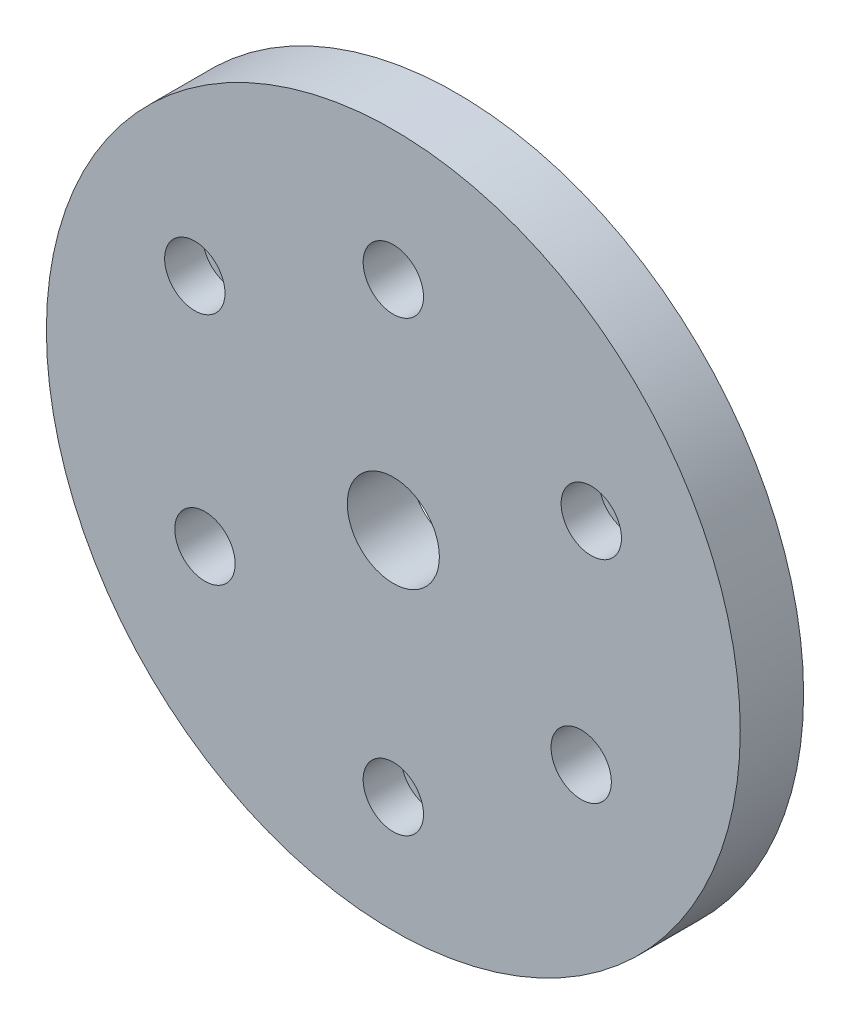
ISO-10303-21;
HEADER;
FILE_DESCRIPTION(('STEP AP214'),'2;1');
FILE_NAME('part.step','',(''),(''),'','','');
FILE_SCHEMA(('AUTOMOTIVE_DESIGN { 1 0 10303 214 1 1 1 1 }'));
ENDSEC;
DATA;
#1=APPLICATION_CONTEXT('core data for automotive mechanical design processes');
#2=APPLICATION_PROTOCOL_DEFINITION('international standard','automotive_design',2000,#1);
#3=PRODUCT_CONTEXT('',#1,'mechanical');
#4=PRODUCT('Part','Part','',(#3));
#5=PRODUCT_RELATED_PRODUCT_CATEGORY('part','',(#4));
#6=PRODUCT_DEFINITION_FORMATION('','',#4);
#7=PRODUCT_DEFINITION_CONTEXT('part definition',#1,'design');
#8=PRODUCT_DEFINITION('design','',#6,#7);
#9=PRODUCT_DEFINITION_SHAPE('','',#8);
#10=(LENGTH_UNIT() NAMED_UNIT(*) SI_UNIT(.MILLI.,.METRE.));
#11=(NAMED_UNIT(*) PLANE_ANGLE_UNIT() SI_UNIT($,.RADIAN.));
#12=(NAMED_UNIT(*) SI_UNIT($,.STERADIAN.) SOLID_ANGLE_UNIT());
#13=UNCERTAINTY_MEASURE_WITH_UNIT(LENGTH_MEASURE(1.E-05),#10,'distance_accuracy_value','');
#14=(GEOMETRIC_REPRESENTATION_CONTEXT(3) GLOBAL_UNCERTAINTY_ASSIGNED_CONTEXT((#13)) GLOBAL_UNIT_ASSIGNED_CONTEXT((#10,
#11,#12)) REPRESENTATION_CONTEXT('',''));
#15=CARTESIAN_POINT('',(0.,0.,0.));
#16=DIRECTION('',(0.,0.,1.));
#17=DIRECTION('',(1.,0.,0.));
#18=AXIS2_PLACEMENT_3D('',#15,#16,#17);
#19=CARTESIAN_POINT('',(0.00189853889458936,0.00435108764818228,0.84932468330565));
#20=DIRECTION('',(0.,0.,1.));
#21=DIRECTION('',(1.,0.,0.));
#22=AXIS2_PLACEMENT_3D('',#19,#20,#21);
#23=CYLINDRICAL_SURFACE('',#22,28.75);
#24=CARTESIAN_POINT('',(0.00189853889458936,0.00435108764818228,0.84932468330565));
#25=DIRECTION('',(0.,0.,1.));
#26=DIRECTION('',(1.,0.,0.));
#27=AXIS2_PLACEMENT_3D('',#24,#25,#26);
#28=CIRCLE('',#27,28.75);
#29=CARTESIAN_POINT('',(28.7518985388946,0.00435108764818228,0.84932468330565));
#30=VERTEX_POINT('',#29);
#31=EDGE_CURVE('E10',#30,#30,#28,.T.);
#32=ORIENTED_EDGE('',*,*,#31,.T.);
#33=EDGE_LOOP('',(#32));
#34=FACE_BOUND('',#33,.T.);
#35=CARTESIAN_POINT('',(0.00189853889458936,0.00435108764818228,6.09932468330565));
#36=DIRECTION('',(0.,0.,1.));
#37=DIRECTION('',(1.,0.,0.));
#38=AXIS2_PLACEMENT_3D('',#35,#36,#37);
#39=CIRCLE('',#38,28.75);
#40=CARTESIAN_POINT('',(28.7518985388946,0.00435108764818228,6.09932468330565));
#41=VERTEX_POINT('',#40);
#42=EDGE_CURVE('E92',#41,#41,#39,.T.);
#43=ORIENTED_EDGE('',*,*,#42,.F.);
#44=EDGE_LOOP('',(#43));
#45=FACE_BOUND('',#44,.T.);
#46=ADVANCED_FACE('F35',(#34,#45),#23,.T.);
#47=CARTESIAN_POINT('',(0.00189853889458936,0.00435108764818228,0.84932468330565));
#48=DIRECTION('',(0.,0.,1.));
#49=DIRECTION('',(1.,0.,0.));
#50=AXIS2_PLACEMENT_3D('',#47,#48,#49);
#51=PLANE('',#50);
#52=CARTESIAN_POINT('',(0.00189853889458936,-19.13581368349,0.84932468330565));
#53=DIRECTION('',(0.,0.,1.));
#54=DIRECTION('',(1.,0.,0.));
#55=AXIS2_PLACEMENT_3D('',#52,#53,#54);
#56=CIRCLE('',#55,1.27143012941237);
#57=CARTESIAN_POINT('',(1.27332866830696,-19.13581368349,0.84932468330565));
#58=VERTEX_POINT('',#57);
#59=EDGE_CURVE('E38',#58,#58,#56,.T.);
#60=ORIENTED_EDGE('',*,*,#59,.T.);
#61=EDGE_LOOP('',(#60));
#62=FACE_BOUND('',#61,.T.);
#63=CARTESIAN_POINT('',(16.4056018001428,8.88352728240437,0.84932468330565));
#64=DIRECTION('',(0.,0.,1.));
#65=DIRECTION('',(1.,0.,0.));
#66=AXIS2_PLACEMENT_3D('',#63,#64,#65);
#67=CIRCLE('',#66,1.27143012941237);
#68=CARTESIAN_POINT('',(17.6770319295552,8.88352728240437,0.84932468330565));
#69=VERTEX_POINT('',#68);
#70=EDGE_CURVE('E55',#69,#69,#67,.T.);
#71=ORIENTED_EDGE('',*,*,#70,.T.);
#72=EDGE_LOOP('',(#71));
#73=FACE_BOUND('',#72,.T.);
#74=CARTESIAN_POINT('',(-16.4490664062779,10.0328198584992,0.84932468330565));
#75=DIRECTION('',(0.,0.,1.));
#76=DIRECTION('',(1.,0.,0.));
#77=AXIS2_PLACEMENT_3D('',#74,#75,#76);
#78=CIRCLE('',#77,1.27143012941237);
#79=CARTESIAN_POINT('',(-15.1776362768655,10.0328198584992,0.84932468330565));
#80=VERTEX_POINT('',#79);
#81=EDGE_CURVE('E51',#80,#80,#78,.T.);
#82=ORIENTED_EDGE('',*,*,#81,.T.);
#83=EDGE_LOOP('',(#82));
#84=FACE_BOUND('',#83,.T.);
#85=CARTESIAN_POINT('',(0.00189853889458936,0.00435108764818228,0.84932468330565));
#86=DIRECTION('',(0.,0.,1.));
#87=DIRECTION('',(1.,0.,0.));
#88=AXIS2_PLACEMENT_3D('',#85,#86,#87);
#89=CIRCLE('',#88,3.81608438061848);
#90=CARTESIAN_POINT('',(3.81798291951307,0.00435108764818228,0.84932468330565));
#91=VERTEX_POINT('',#90);
#92=EDGE_CURVE('E95',#91,#91,#89,.T.);
#93=ORIENTED_EDGE('',*,*,#92,.T.);
#94=EDGE_LOOP('',(#93));
#95=FACE_BOUND('',#94,.T.);
#96=CARTESIAN_POINT('',(-15.607569395895,-8.95915887178049,0.84932468330565));
#97=DIRECTION('',(0.,0.,1.));
#98=DIRECTION('',(1.,0.,0.));
#99=AXIS2_PLACEMENT_3D('',#96,#97,#98);
#100=CIRCLE('',#99,2.50000000000007);
#101=CARTESIAN_POINT('',(-13.1075693958949,-8.95915887178049,0.84932468330565));
#102=VERTEX_POINT('',#101);
#103=EDGE_CURVE('E98',#102,#102,#100,.T.);
#104=ORIENTED_EDGE('',*,*,#103,.T.);
#105=EDGE_LOOP('',(#104));
#106=FACE_BOUND('',#105,.T.);
#107=CARTESIAN_POINT('',(0.00189853889459128,18.0043510876482,0.84932468330565));
#108=DIRECTION('',(0.,0.,1.));
#109=DIRECTION('',(1.,0.,0.));
#110=AXIS2_PLACEMENT_3D('',#107,#108,#109);
#111=CIRCLE('',#110,2.5);
#112=CARTESIAN_POINT('',(2.50189853889459,18.0043510876482,0.84932468330565));
#113=VERTEX_POINT('',#112);
#114=EDGE_CURVE('E47',#113,#113,#111,.T.);
#115=ORIENTED_EDGE('',*,*,#114,.T.);
#116=EDGE_LOOP('',(#115));
#117=FACE_BOUND('',#116,.T.);
#118=CARTESIAN_POINT('',(15.5692598382296,-9.03208970372346,0.84932468330565));
#119=DIRECTION('',(0.,0.,1.));
#120=DIRECTION('',(1.,0.,0.));
#121=AXIS2_PLACEMENT_3D('',#118,#119,#120);
#122=CIRCLE('',#121,2.49999999999985);
#123=CARTESIAN_POINT('',(18.0692598382295,-9.03208970372346,0.84932468330565));
#124=VERTEX_POINT('',#123);
#125=EDGE_CURVE('E42',#124,#124,#122,.T.);
#126=ORIENTED_EDGE('',*,*,#125,.T.);
#127=EDGE_LOOP('',(#126));
#128=FACE_BOUND('',#127,.T.);
#129=ORIENTED_EDGE('',*,*,#31,.F.);
#130=EDGE_LOOP('',(#129));
#131=FACE_BOUND('',#130,.T.);
#132=ADVANCED_FACE('F103',(#62,#73,#84,#95,#106,#117,#128,#131),#51,.F.);
#133=CARTESIAN_POINT('',(15.5692598382296,-9.03208970372346,0.84932468330565));
#134=DIRECTION('',(0.,0.,1.));
#135=DIRECTION('',(1.,0.,0.));
#136=AXIS2_PLACEMENT_3D('',#133,#134,#135);
#137=CYLINDRICAL_SURFACE('',#136,2.49999999999985);
#138=ORIENTED_EDGE('',*,*,#125,.F.);
#139=EDGE_LOOP('',(#138));
#140=FACE_BOUND('',#139,.T.);
#141=CARTESIAN_POINT('',(15.5692598382296,-9.03208970372346,6.09932468330565));
#142=DIRECTION('',(0.,0.,1.));
#143=DIRECTION('',(1.,0.,0.));
#144=AXIS2_PLACEMENT_3D('',#141,#142,#143);
#145=CIRCLE('',#144,2.49999999999985);
#146=CARTESIAN_POINT('',(18.0692598382295,-9.03208970372346,6.09932468330565));
#147=VERTEX_POINT('',#146);
#148=EDGE_CURVE('E89',#147,#147,#145,.T.);
#149=ORIENTED_EDGE('',*,*,#148,.T.);
#150=EDGE_LOOP('',(#149));
#151=FACE_BOUND('',#150,.T.);
#152=ADVANCED_FACE('F110',(#140,#151),#137,.F.);
#153=CARTESIAN_POINT('',(0.00189853889459128,18.0043510876482,0.84932468330565));
#154=DIRECTION('',(0.,0.,1.));
#155=DIRECTION('',(1.,0.,0.));
#156=AXIS2_PLACEMENT_3D('',#153,#154,#155);
#157=CYLINDRICAL_SURFACE('',#156,2.5);
#158=ORIENTED_EDGE('',*,*,#114,.F.);
#159=EDGE_LOOP('',(#158));
#160=FACE_BOUND('',#159,.T.);
#161=CARTESIAN_POINT('',(0.00189853889459128,18.0043510876482,6.09932468330565));
#162=DIRECTION('',(0.,0.,1.));
#163=DIRECTION('',(1.,0.,0.));
#164=AXIS2_PLACEMENT_3D('',#161,#162,#163);
#165=CIRCLE('',#164,2.5);
#166=CARTESIAN_POINT('',(2.50189853889459,18.0043510876482,6.09932468330565));
#167=VERTEX_POINT('',#166);
#168=EDGE_CURVE('E86',#167,#167,#165,.T.);
#169=ORIENTED_EDGE('',*,*,#168,.T.);
#170=EDGE_LOOP('',(#169));
#171=FACE_BOUND('',#170,.T.);
#172=ADVANCED_FACE('F106',(#160,#171),#157,.F.);
#173=CARTESIAN_POINT('',(-15.607569395895,-8.95915887178049,0.84932468330565));
#174=DIRECTION('',(0.,0.,1.));
#175=DIRECTION('',(1.,0.,0.));
#176=AXIS2_PLACEMENT_3D('',#173,#174,#175);
#177=CYLINDRICAL_SURFACE('',#176,2.50000000000007);
#178=ORIENTED_EDGE('',*,*,#103,.F.);
#179=EDGE_LOOP('',(#178));
#180=FACE_BOUND('',#179,.T.);
#181=CARTESIAN_POINT('',(-15.607569395895,-8.95915887178049,6.09932468330565));
#182=DIRECTION('',(0.,0.,1.));
#183=DIRECTION('',(1.,0.,0.));
#184=AXIS2_PLACEMENT_3D('',#181,#182,#183);
#185=CIRCLE('',#184,2.50000000000007);
#186=CARTESIAN_POINT('',(-13.1075693958949,-8.95915887178049,6.09932468330565));
#187=VERTEX_POINT('',#186);
#188=EDGE_CURVE('E83',#187,#187,#185,.T.);
#189=ORIENTED_EDGE('',*,*,#188,.T.);
#190=EDGE_LOOP('',(#189));
#191=FACE_BOUND('',#190,.T.);
#192=ADVANCED_FACE('F109',(#180,#191),#177,.F.);
#193=CARTESIAN_POINT('',(0.00189853889458936,0.00435108764818228,0.84932468330565));
#194=DIRECTION('',(0.,0.,1.));
#195=DIRECTION('',(1.,0.,0.));
#196=AXIS2_PLACEMENT_3D('',#193,#194,#195);
#197=CYLINDRICAL_SURFACE('',#196,3.81608438061848);
#198=ORIENTED_EDGE('',*,*,#92,.F.);
#199=EDGE_LOOP('',(#198));
#200=FACE_BOUND('',#199,.T.);
#201=CARTESIAN_POINT('',(0.00189853889458936,0.00435108764818228,6.09932468330565));
#202=DIRECTION('',(0.,0.,1.));
#203=DIRECTION('',(1.,0.,0.));
#204=AXIS2_PLACEMENT_3D('',#201,#202,#203);
#205=CIRCLE('',#204,3.81608438061848);
#206=CARTESIAN_POINT('',(3.81798291951307,0.00435108764818228,6.09932468330565));
#207=VERTEX_POINT('',#206);
#208=EDGE_CURVE('E53',#207,#207,#205,.T.);
#209=ORIENTED_EDGE('',*,*,#208,.T.);
#210=EDGE_LOOP('',(#209));
#211=FACE_BOUND('',#210,.T.);
#212=ADVANCED_FACE('F118',(#200,#211),#197,.F.);
#213=CARTESIAN_POINT('',(0.00189853889458936,0.00435108764818228,6.09932468330565));
#214=DIRECTION('',(0.,0.,1.));
#215=DIRECTION('',(1.,0.,0.));
#216=AXIS2_PLACEMENT_3D('',#213,#214,#215);
#217=PLANE('',#216);
#218=CARTESIAN_POINT('',(0.00189853889458936,-19.13581368349,6.09932468330565));
#219=DIRECTION('',(0.,0.,1.));
#220=DIRECTION('',(1.,0.,0.));
#221=AXIS2_PLACEMENT_3D('',#218,#219,#220);
#222=CIRCLE('',#221,2.5);
#223=CARTESIAN_POINT('',(2.50189853889459,-19.13581368349,6.09932468330565));
#224=VERTEX_POINT('',#223);
#225=EDGE_CURVE('E215',#224,#224,#222,.T.);
#226=ORIENTED_EDGE('',*,*,#225,.F.);
#227=EDGE_LOOP('',(#226));
#228=FACE_BOUND('',#227,.T.);
#229=CARTESIAN_POINT('',(16.4056018001428,8.88352728240437,6.09932468330565));
#230=DIRECTION('',(0.,0.,1.));
#231=DIRECTION('',(1.,0.,0.));
#232=AXIS2_PLACEMENT_3D('',#229,#230,#231);
#233=CIRCLE('',#232,2.5);
#234=CARTESIAN_POINT('',(18.9056018001428,8.88352728240437,6.09932468330565));
#235=VERTEX_POINT('',#234);
#236=EDGE_CURVE('E225',#235,#235,#233,.T.);
#237=ORIENTED_EDGE('',*,*,#236,.F.);
#238=EDGE_LOOP('',(#237));
#239=FACE_BOUND('',#238,.T.);
#240=CARTESIAN_POINT('',(-16.4490664062779,10.0328198584992,6.09932468330565));
#241=DIRECTION('',(0.,0.,1.));
#242=DIRECTION('',(1.,0.,0.));
#243=AXIS2_PLACEMENT_3D('',#240,#241,#242);
#244=CIRCLE('',#243,2.5);
#245=CARTESIAN_POINT('',(-13.9490664062779,10.0328198584992,6.09932468330565));
#246=VERTEX_POINT('',#245);
#247=EDGE_CURVE('E57',#246,#246,#244,.T.);
#248=ORIENTED_EDGE('',*,*,#247,.F.);
#249=EDGE_LOOP('',(#248));
#250=FACE_BOUND('',#249,.T.);
#251=ORIENTED_EDGE('',*,*,#188,.F.);
#252=EDGE_LOOP('',(#251));
#253=FACE_BOUND('',#252,.T.);
#254=ORIENTED_EDGE('',*,*,#148,.F.);
#255=EDGE_LOOP('',(#254));
#256=FACE_BOUND('',#255,.T.);
#257=ORIENTED_EDGE('',*,*,#42,.T.);
#258=EDGE_LOOP('',(#257));
#259=FACE_BOUND('',#258,.T.);
#260=ORIENTED_EDGE('',*,*,#168,.F.);
#261=EDGE_LOOP('',(#260));
#262=FACE_BOUND('',#261,.T.);
#263=ORIENTED_EDGE('',*,*,#208,.F.);
#264=EDGE_LOOP('',(#263));
#265=FACE_BOUND('',#264,.T.);
#266=ADVANCED_FACE('F114',(#228,#239,#250,#253,#256,#259,#262,#265),#217,.T.);
#267=CARTESIAN_POINT('',(-16.4490664062779,10.0328198584992,1.09932468330565));
#268=DIRECTION('',(0.,0.,1.));
#269=DIRECTION('',(1.,0.,0.));
#270=AXIS2_PLACEMENT_3D('',#267,#268,#269);
#271=CONICAL_SURFACE('',#270,1.6875,1.02974425867665);
#272=CARTESIAN_POINT('',(-16.4490664062779,10.0328198584992,1.09932468330565));
#273=DIRECTION('',(0.,0.,1.));
#274=DIRECTION('',(1.,0.,0.));
#275=AXIS2_PLACEMENT_3D('',#272,#273,#274);
#276=CIRCLE('',#275,1.6875);
#277=CARTESIAN_POINT('',(-14.7615664062779,10.0328198584992,1.09932468330565));
#278=VERTEX_POINT('',#277);
#279=EDGE_CURVE('E54',#278,#278,#276,.T.);
#280=ORIENTED_EDGE('',*,*,#279,.T.);
#281=EDGE_LOOP('',(#280));
#282=FACE_BOUND('',#281,.T.);
#283=ORIENTED_EDGE('',*,*,#81,.F.);
#284=EDGE_LOOP('',(#283));
#285=FACE_BOUND('',#284,.T.);
#286=ADVANCED_FACE('F117',(#282,#285),#271,.F.);
#287=CARTESIAN_POINT('',(-16.4490664062779,10.0328198584992,6.09932468330565));
#288=DIRECTION('',(0.,0.,1.));
#289=DIRECTION('',(1.,0.,0.));
#290=AXIS2_PLACEMENT_3D('',#287,#288,#289);
#291=CYLINDRICAL_SURFACE('',#290,1.6875);
#292=ORIENTED_EDGE('',*,*,#279,.F.);
#293=EDGE_LOOP('',(#292));
#294=FACE_BOUND('',#293,.T.);
#295=CARTESIAN_POINT('',(-16.4490664062779,10.0328198584992,2.94932468330565));
#296=DIRECTION('',(0.,0.,1.));
#297=DIRECTION('',(1.,0.,0.));
#298=AXIS2_PLACEMENT_3D('',#295,#296,#297);
#299=CIRCLE('',#298,1.6875);
#300=CARTESIAN_POINT('',(-14.7615664062779,10.0328198584992,2.94932468330565));
#301=VERTEX_POINT('',#300);
#302=EDGE_CURVE('E76',#301,#301,#299,.T.);
#303=ORIENTED_EDGE('',*,*,#302,.T.);
#304=EDGE_LOOP('',(#303));
#305=FACE_BOUND('',#304,.T.);
#306=ADVANCED_FACE('F160',(#294,#305),#291,.F.);
#307=CARTESIAN_POINT('',(-14.7615664062779,10.0328198584992,2.94932468330565));
#308=DIRECTION('',(0.,0.,-1.));
#309=DIRECTION('',(-1.,0.,0.));
#310=AXIS2_PLACEMENT_3D('',#307,#308,#309);
#311=PLANE('',#310);
#312=ORIENTED_EDGE('',*,*,#302,.F.);
#313=EDGE_LOOP('',(#312));
#314=FACE_BOUND('',#313,.T.);
#315=CARTESIAN_POINT('',(-16.4490664062779,10.0328198584992,2.94932468330565));
#316=DIRECTION('',(0.,0.,1.));
#317=DIRECTION('',(1.,0.,0.));
#318=AXIS2_PLACEMENT_3D('',#315,#316,#317);
#319=CIRCLE('',#318,2.5);
#320=CARTESIAN_POINT('',(-13.9490664062779,10.0328198584992,2.94932468330565));
#321=VERTEX_POINT('',#320);
#322=EDGE_CURVE('E62',#321,#321,#319,.T.);
#323=ORIENTED_EDGE('',*,*,#322,.T.);
#324=EDGE_LOOP('',(#323));
#325=FACE_BOUND('',#324,.T.);
#326=ADVANCED_FACE('F166',(#314,#325),#311,.F.);
#327=CARTESIAN_POINT('',(-16.4490664062779,10.0328198584992,6.09932468330565));
#328=DIRECTION('',(0.,0.,1.));
#329=DIRECTION('',(1.,0.,0.));
#330=AXIS2_PLACEMENT_3D('',#327,#328,#329);
#331=CYLINDRICAL_SURFACE('',#330,2.5);
#332=ORIENTED_EDGE('',*,*,#322,.F.);
#333=EDGE_LOOP('',(#332));
#334=FACE_BOUND('',#333,.T.);
#335=ORIENTED_EDGE('',*,*,#247,.T.);
#336=EDGE_LOOP('',(#335));
#337=FACE_BOUND('',#336,.T.);
#338=ADVANCED_FACE('F172',(#334,#337),#331,.F.);
#339=CARTESIAN_POINT('',(16.4056018001428,8.88352728240437,1.09932468330565));
#340=DIRECTION('',(0.,0.,1.));
#341=DIRECTION('',(1.,0.,0.));
#342=AXIS2_PLACEMENT_3D('',#339,#340,#341);
#343=CONICAL_SURFACE('',#342,1.6875,1.02974425867665);
#344=CARTESIAN_POINT('',(16.4056018001428,8.88352728240437,1.09932468330565));
#345=DIRECTION('',(0.,0.,1.));
#346=DIRECTION('',(1.,0.,0.));
#347=AXIS2_PLACEMENT_3D('',#344,#345,#346);
#348=CIRCLE('',#347,1.6875);
#349=CARTESIAN_POINT('',(18.0931018001428,8.88352728240437,1.09932468330565));
#350=VERTEX_POINT('',#349);
#351=EDGE_CURVE('E58',#350,#350,#348,.T.);
#352=ORIENTED_EDGE('',*,*,#351,.T.);
#353=EDGE_LOOP('',(#352));
#354=FACE_BOUND('',#353,.T.);
#355=ORIENTED_EDGE('',*,*,#70,.F.);
#356=EDGE_LOOP('',(#355));
#357=FACE_BOUND('',#356,.T.);
#358=ADVANCED_FACE('F176',(#354,#357),#343,.F.);
#359=CARTESIAN_POINT('',(16.4056018001428,8.88352728240437,6.09932468330565));
#360=DIRECTION('',(0.,0.,1.));
#361=DIRECTION('',(1.,0.,0.));
#362=AXIS2_PLACEMENT_3D('',#359,#360,#361);
#363=CYLINDRICAL_SURFACE('',#362,1.6875);
#364=ORIENTED_EDGE('',*,*,#351,.F.);
#365=EDGE_LOOP('',(#364));
#366=FACE_BOUND('',#365,.T.);
#367=CARTESIAN_POINT('',(16.4056018001428,8.88352728240437,2.94932468330565));
#368=DIRECTION('',(0.,0.,1.));
#369=DIRECTION('',(1.,0.,0.));
#370=AXIS2_PLACEMENT_3D('',#367,#368,#369);
#371=CIRCLE('',#370,1.6875);
#372=CARTESIAN_POINT('',(18.0931018001428,8.88352728240437,2.94932468330565));
#373=VERTEX_POINT('',#372);
#374=EDGE_CURVE('E65',#373,#373,#371,.T.);
#375=ORIENTED_EDGE('',*,*,#374,.T.);
#376=EDGE_LOOP('',(#375));
#377=FACE_BOUND('',#376,.T.);
#378=ADVANCED_FACE('F180',(#366,#377),#363,.F.);
#379=CARTESIAN_POINT('',(18.0931018001428,8.88352728240437,2.94932468330565));
#380=DIRECTION('',(0.,0.,-1.));
#381=DIRECTION('',(-1.,0.,0.));
#382=AXIS2_PLACEMENT_3D('',#379,#380,#381);
#383=PLANE('',#382);
#384=ORIENTED_EDGE('',*,*,#374,.F.);
#385=EDGE_LOOP('',(#384));
#386=FACE_BOUND('',#385,.T.);
#387=CARTESIAN_POINT('',(16.4056018001428,8.88352728240437,2.94932468330565));
#388=DIRECTION('',(0.,0.,1.));
#389=DIRECTION('',(1.,0.,0.));
#390=AXIS2_PLACEMENT_3D('',#387,#388,#389);
#391=CIRCLE('',#390,2.5);
#392=CARTESIAN_POINT('',(18.9056018001428,8.88352728240437,2.94932468330565));
#393=VERTEX_POINT('',#392);
#394=EDGE_CURVE('E70',#393,#393,#391,.T.);
#395=ORIENTED_EDGE('',*,*,#394,.T.);
#396=EDGE_LOOP('',(#395));
#397=FACE_BOUND('',#396,.T.);
#398=ADVANCED_FACE('F183',(#386,#397),#383,.F.);
#399=CARTESIAN_POINT('',(16.4056018001428,8.88352728240437,6.09932468330565));
#400=DIRECTION('',(0.,0.,1.));
#401=DIRECTION('',(1.,0.,0.));
#402=AXIS2_PLACEMENT_3D('',#399,#400,#401);
#403=CYLINDRICAL_SURFACE('',#402,2.5);
#404=ORIENTED_EDGE('',*,*,#394,.F.);
#405=EDGE_LOOP('',(#404));
#406=FACE_BOUND('',#405,.T.);
#407=ORIENTED_EDGE('',*,*,#236,.T.);
#408=EDGE_LOOP('',(#407));
#409=FACE_BOUND('',#408,.T.);
#410=ADVANCED_FACE('F187',(#406,#409),#403,.F.);
#411=CARTESIAN_POINT('',(0.00189853889458936,-19.13581368349,1.09932468330565));
#412=DIRECTION('',(0.,0.,1.));
#413=DIRECTION('',(1.,0.,0.));
#414=AXIS2_PLACEMENT_3D('',#411,#412,#413);
#415=CONICAL_SURFACE('',#414,1.6875,1.02974425867665);
#416=CARTESIAN_POINT('',(0.00189853889458936,-19.13581368349,1.09932468330565));
#417=DIRECTION('',(0.,0.,1.));
#418=DIRECTION('',(1.,0.,0.));
#419=AXIS2_PLACEMENT_3D('',#416,#417,#418);
#420=CIRCLE('',#419,1.6875);
#421=CARTESIAN_POINT('',(1.68939853889459,-19.13581368349,1.09932468330565));
#422=VERTEX_POINT('',#421);
#423=EDGE_CURVE('E222',#422,#422,#420,.T.);
#424=ORIENTED_EDGE('',*,*,#423,.T.);
#425=EDGE_LOOP('',(#424));
#426=FACE_BOUND('',#425,.T.);
#427=ORIENTED_EDGE('',*,*,#59,.F.);
#428=EDGE_LOOP('',(#427));
#429=FACE_BOUND('',#428,.T.);
#430=ADVANCED_FACE('F191',(#426,#429),#415,.F.);
#431=CARTESIAN_POINT('',(0.00189853889458936,-19.13581368349,6.09932468330565));
#432=DIRECTION('',(0.,0.,1.));
#433=DIRECTION('',(1.,0.,0.));
#434=AXIS2_PLACEMENT_3D('',#431,#432,#433);
#435=CYLINDRICAL_SURFACE('',#434,1.6875);
#436=ORIENTED_EDGE('',*,*,#423,.F.);
#437=EDGE_LOOP('',(#436));
#438=FACE_BOUND('',#437,.T.);
#439=CARTESIAN_POINT('',(0.00189853889458936,-19.13581368349,2.94932468330565));
#440=DIRECTION('',(0.,0.,1.));
#441=DIRECTION('',(1.,0.,0.));
#442=AXIS2_PLACEMENT_3D('',#439,#440,#441);
#443=CIRCLE('',#442,1.6875);
#444=CARTESIAN_POINT('',(1.68939853889459,-19.13581368349,2.94932468330565));
#445=VERTEX_POINT('',#444);
#446=EDGE_CURVE('E217',#445,#445,#443,.T.);
#447=ORIENTED_EDGE('',*,*,#446,.T.);
#448=EDGE_LOOP('',(#447));
#449=FACE_BOUND('',#448,.T.);
#450=ADVANCED_FACE('F195',(#438,#449),#435,.F.);
#451=CARTESIAN_POINT('',(1.68939853889459,-19.13581368349,2.94932468330565));
#452=DIRECTION('',(0.,0.,-1.));
#453=DIRECTION('',(-1.,0.,0.));
#454=AXIS2_PLACEMENT_3D('',#451,#452,#453);
#455=PLANE('',#454);
#456=ORIENTED_EDGE('',*,*,#446,.F.);
#457=EDGE_LOOP('',(#456));
#458=FACE_BOUND('',#457,.T.);
#459=CARTESIAN_POINT('',(0.00189853889458936,-19.13581368349,2.94932468330565));
#460=DIRECTION('',(0.,0.,1.));
#461=DIRECTION('',(1.,0.,0.));
#462=AXIS2_PLACEMENT_3D('',#459,#460,#461);
#463=CIRCLE('',#462,2.5);
#464=CARTESIAN_POINT('',(2.50189853889459,-19.13581368349,2.94932468330565));
#465=VERTEX_POINT('',#464);
#466=EDGE_CURVE('E212',#465,#465,#463,.T.);
#467=ORIENTED_EDGE('',*,*,#466,.T.);
#468=EDGE_LOOP('',(#467));
#469=FACE_BOUND('',#468,.T.);
#470=ADVANCED_FACE('F199',(#458,#469),#455,.F.);
#471=CARTESIAN_POINT('',(0.00189853889458936,-19.13581368349,6.09932468330565));
#472=DIRECTION('',(0.,0.,1.));
#473=DIRECTION('',(1.,0.,0.));
#474=AXIS2_PLACEMENT_3D('',#471,#472,#473);
#475=CYLINDRICAL_SURFACE('',#474,2.5);
#476=ORIENTED_EDGE('',*,*,#466,.F.);
#477=EDGE_LOOP('',(#476));
#478=FACE_BOUND('',#477,.T.);
#479=ORIENTED_EDGE('',*,*,#225,.T.);
#480=EDGE_LOOP('',(#479));
#481=FACE_BOUND('',#480,.T.);
#482=ADVANCED_FACE('F203',(#478,#481),#475,.F.);
#483=CLOSED_SHELL('',(#46,#132,#152,#172,#192,#212,#266,#286,#306,#326,#338,#358,#378,#398,#410,
#430,#450,#470,#482));
#484=MANIFOLD_SOLID_BREP('B2',#483);
#485=ADVANCED_BREP_SHAPE_REPRESENTATION('',(#18,#484),#14);
#486=SHAPE_DEFINITION_REPRESENTATION(#9,#485);
ENDSEC;
END-ISO-10303-21;
